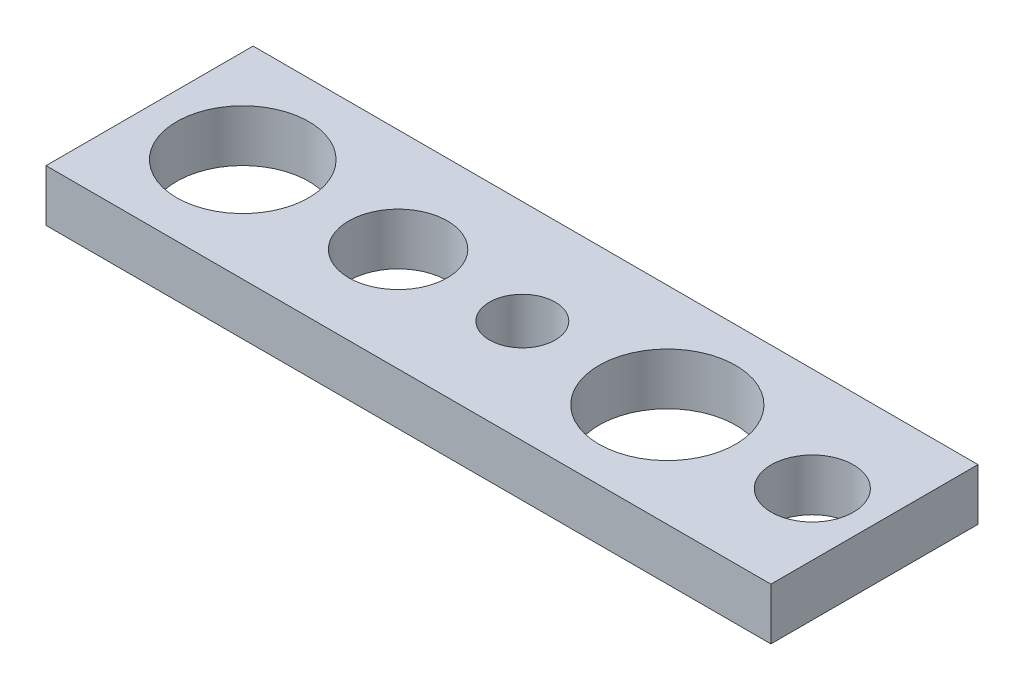
ISO-10303-21;
HEADER;
FILE_DESCRIPTION(('STEP AP214'),'2;1');
FILE_NAME('part.step','',(''),(''),'','','');
FILE_SCHEMA(('AUTOMOTIVE_DESIGN { 1 0 10303 214 1 1 1 1 }'));
ENDSEC;
DATA;
#1=APPLICATION_CONTEXT('core data for automotive mechanical design processes');
#2=APPLICATION_PROTOCOL_DEFINITION('international standard','automotive_design',2000,#1);
#3=PRODUCT_CONTEXT('',#1,'mechanical');
#4=PRODUCT('Part','Part','',(#3));
#5=PRODUCT_RELATED_PRODUCT_CATEGORY('part','',(#4));
#6=PRODUCT_DEFINITION_FORMATION('','',#4);
#7=PRODUCT_DEFINITION_CONTEXT('part definition',#1,'design');
#8=PRODUCT_DEFINITION('design','',#6,#7);
#9=PRODUCT_DEFINITION_SHAPE('','',#8);
#10=(LENGTH_UNIT() NAMED_UNIT(*) SI_UNIT(.MILLI.,.METRE.));
#11=(NAMED_UNIT(*) PLANE_ANGLE_UNIT() SI_UNIT($,.RADIAN.));
#12=(NAMED_UNIT(*) SI_UNIT($,.STERADIAN.) SOLID_ANGLE_UNIT());
#13=UNCERTAINTY_MEASURE_WITH_UNIT(LENGTH_MEASURE(1.E-05),#10,'distance_accuracy_value','');
#14=(GEOMETRIC_REPRESENTATION_CONTEXT(3) GLOBAL_UNCERTAINTY_ASSIGNED_CONTEXT((#13)) GLOBAL_UNIT_ASSIGNED_CONTEXT((#10,
#11,#12)) REPRESENTATION_CONTEXT('',''));
#15=CARTESIAN_POINT('',(0.,0.,0.));
#16=DIRECTION('',(0.,0.,1.));
#17=DIRECTION('',(1.,0.,0.));
#18=AXIS2_PLACEMENT_3D('',#15,#16,#17);
#19=CARTESIAN_POINT('',(-15.5555555555556,5.,-7.72727272727273));
#20=DIRECTION('',(1.,0.,0.));
#21=DIRECTION('',(0.,0.,-1.));
#22=AXIS2_PLACEMENT_3D('',#19,#20,#21);
#23=PLANE('',#22);
#24=DIRECTION('',(0.,0.,1.));
#25=VECTOR('',#24,1.);
#26=CARTESIAN_POINT('',(-15.5555555555556,0.,-7.72727272727273));
#27=LINE('',#26,#25);
#28=CARTESIAN_POINT('',(-15.5555555555556,0.,-7.72727272727273));
#29=VERTEX_POINT('',#28);
#30=CARTESIAN_POINT('',(-15.5555555555556,0.,12.2727272727273));
#31=VERTEX_POINT('',#30);
#32=EDGE_CURVE('E96',#29,#31,#27,.T.);
#33=ORIENTED_EDGE('',*,*,#32,.T.);
#34=DIRECTION('',(0.,-1.,0.));
#35=VECTOR('',#34,1.);
#36=CARTESIAN_POINT('',(-15.5555555555556,5.,12.2727272727273));
#37=LINE('',#36,#35);
#38=CARTESIAN_POINT('',(-15.5555555555556,5.,12.2727272727273));
#39=VERTEX_POINT('',#38);
#40=EDGE_CURVE('E11',#39,#31,#37,.T.);
#41=ORIENTED_EDGE('',*,*,#40,.F.);
#42=DIRECTION('',(0.,0.,1.));
#43=VECTOR('',#42,1.);
#44=CARTESIAN_POINT('',(-15.5555555555556,5.,-7.72727272727273));
#45=LINE('',#44,#43);
#46=CARTESIAN_POINT('',(-15.5555555555556,5.,-7.72727272727273));
#47=VERTEX_POINT('',#46);
#48=EDGE_CURVE('E84',#47,#39,#45,.T.);
#49=ORIENTED_EDGE('',*,*,#48,.F.);
#50=DIRECTION('',(0.,-1.,0.));
#51=VECTOR('',#50,1.);
#52=CARTESIAN_POINT('',(-15.5555555555556,5.,-7.72727272727273));
#53=LINE('',#52,#51);
#54=EDGE_CURVE('E92',#47,#29,#53,.T.);
#55=ORIENTED_EDGE('',*,*,#54,.T.);
#56=EDGE_LOOP('',(#33,#41,#49,#55));
#57=FACE_BOUND('',#56,.T.);
#58=ADVANCED_FACE('F33',(#57),#23,.F.);
#59=CARTESIAN_POINT('',(-15.5555555555556,5.,12.2727272727273));
#60=DIRECTION('',(0.,0.,-1.));
#61=DIRECTION('',(-1.,0.,0.));
#62=AXIS2_PLACEMENT_3D('',#59,#60,#61);
#63=PLANE('',#62);
#64=DIRECTION('',(1.,0.,0.));
#65=VECTOR('',#64,1.);
#66=CARTESIAN_POINT('',(-15.5555555555556,0.,12.2727272727273));
#67=LINE('',#66,#65);
#68=CARTESIAN_POINT('',(54.4444444444444,0.,12.2727272727273));
#69=VERTEX_POINT('',#68);
#70=EDGE_CURVE('E88',#31,#69,#67,.T.);
#71=ORIENTED_EDGE('',*,*,#70,.T.);
#72=DIRECTION('',(0.,-1.,0.));
#73=VECTOR('',#72,1.);
#74=CARTESIAN_POINT('',(54.4444444444444,5.,12.2727272727273));
#75=LINE('',#74,#73);
#76=CARTESIAN_POINT('',(54.4444444444444,5.,12.2727272727273));
#77=VERTEX_POINT('',#76);
#78=EDGE_CURVE('E41',#77,#69,#75,.T.);
#79=ORIENTED_EDGE('',*,*,#78,.F.);
#80=DIRECTION('',(1.,0.,0.));
#81=VECTOR('',#80,1.);
#82=CARTESIAN_POINT('',(-15.5555555555556,5.,12.2727272727273));
#83=LINE('',#82,#81);
#84=EDGE_CURVE('E79',#39,#77,#83,.T.);
#85=ORIENTED_EDGE('',*,*,#84,.F.);
#86=ORIENTED_EDGE('',*,*,#40,.T.);
#87=EDGE_LOOP('',(#71,#79,#85,#86));
#88=FACE_BOUND('',#87,.T.);
#89=ADVANCED_FACE('F87',(#88),#63,.F.);
#90=CARTESIAN_POINT('',(54.4444444444444,5.,-7.72727272727273));
#91=DIRECTION('',(-1.,0.,0.));
#92=DIRECTION('',(0.,0.,1.));
#93=AXIS2_PLACEMENT_3D('',#90,#91,#92);
#94=PLANE('',#93);
#95=DIRECTION('',(0.,0.,-1.));
#96=VECTOR('',#95,1.);
#97=CARTESIAN_POINT('',(54.4444444444444,0.,-7.72727272727273));
#98=LINE('',#97,#96);
#99=CARTESIAN_POINT('',(54.4444444444444,0.,-7.72727272727273));
#100=VERTEX_POINT('',#99);
#101=EDGE_CURVE('E66',#69,#100,#98,.T.);
#102=ORIENTED_EDGE('',*,*,#101,.T.);
#103=DIRECTION('',(0.,-1.,0.));
#104=VECTOR('',#103,1.);
#105=CARTESIAN_POINT('',(54.4444444444444,5.,-7.72727272727273));
#106=LINE('',#105,#104);
#107=CARTESIAN_POINT('',(54.4444444444444,5.,-7.72727272727273));
#108=VERTEX_POINT('',#107);
#109=EDGE_CURVE('E89',#108,#100,#106,.T.);
#110=ORIENTED_EDGE('',*,*,#109,.F.);
#111=DIRECTION('',(0.,0.,-1.));
#112=VECTOR('',#111,1.);
#113=CARTESIAN_POINT('',(54.4444444444444,5.,-7.72727272727273));
#114=LINE('',#113,#112);
#115=EDGE_CURVE('E82',#77,#108,#114,.T.);
#116=ORIENTED_EDGE('',*,*,#115,.F.);
#117=ORIENTED_EDGE('',*,*,#78,.T.);
#118=EDGE_LOOP('',(#102,#110,#116,#117));
#119=FACE_BOUND('',#118,.T.);
#120=ADVANCED_FACE('F90',(#119),#94,.F.);
#121=CARTESIAN_POINT('',(-15.5555555555556,5.,-7.72727272727273));
#122=DIRECTION('',(0.,0.,1.));
#123=DIRECTION('',(1.,0.,0.));
#124=AXIS2_PLACEMENT_3D('',#121,#122,#123);
#125=PLANE('',#124);
#126=DIRECTION('',(-1.,0.,0.));
#127=VECTOR('',#126,1.);
#128=CARTESIAN_POINT('',(-15.5555555555556,0.,-7.72727272727273));
#129=LINE('',#128,#127);
#130=EDGE_CURVE('E72',#100,#29,#129,.T.);
#131=ORIENTED_EDGE('',*,*,#130,.T.);
#132=ORIENTED_EDGE('',*,*,#54,.F.);
#133=DIRECTION('',(-1.,0.,0.));
#134=VECTOR('',#133,1.);
#135=CARTESIAN_POINT('',(-15.5555555555556,5.,-7.72727272727273));
#136=LINE('',#135,#134);
#137=EDGE_CURVE('E49',#108,#47,#136,.T.);
#138=ORIENTED_EDGE('',*,*,#137,.F.);
#139=ORIENTED_EDGE('',*,*,#109,.T.);
#140=EDGE_LOOP('',(#131,#132,#138,#139));
#141=FACE_BOUND('',#140,.T.);
#142=ADVANCED_FACE('F104',(#141),#125,.F.);
#143=CARTESIAN_POINT('',(0.,5.,0.));
#144=DIRECTION('',(0.,1.,0.));
#145=DIRECTION('',(0.,0.,1.));
#146=AXIS2_PLACEMENT_3D('',#143,#144,#145);
#147=PLANE('',#146);
#148=CARTESIAN_POINT('',(-6.55555555555556,5.,2.27272727272727));
#149=DIRECTION('',(0.,1.,0.));
#150=DIRECTION('',(0.,0.,1.));
#151=AXIS2_PLACEMENT_3D('',#148,#149,#150);
#152=CIRCLE('',#151,6.375);
#153=CARTESIAN_POINT('',(-6.55555555555556,5.,8.64772727272727));
#154=VERTEX_POINT('',#153);
#155=EDGE_CURVE('E134',#154,#154,#152,.T.);
#156=ORIENTED_EDGE('',*,*,#155,.F.);
#157=EDGE_LOOP('',(#156));
#158=FACE_BOUND('',#157,.T.);
#159=CARTESIAN_POINT('',(8.44444444444444,5.,2.27272727272727));
#160=DIRECTION('',(0.,1.,0.));
#161=DIRECTION('',(0.,0.,1.));
#162=AXIS2_PLACEMENT_3D('',#159,#160,#161);
#163=CIRCLE('',#162,4.7625);
#164=CARTESIAN_POINT('',(8.44444444444444,5.,7.03522727272727));
#165=VERTEX_POINT('',#164);
#166=EDGE_CURVE('E128',#165,#165,#163,.T.);
#167=ORIENTED_EDGE('',*,*,#166,.F.);
#168=EDGE_LOOP('',(#167));
#169=FACE_BOUND('',#168,.T.);
#170=CARTESIAN_POINT('',(20.4444444444444,5.,2.27272727272727));
#171=DIRECTION('',(0.,1.,0.));
#172=DIRECTION('',(0.,0.,1.));
#173=AXIS2_PLACEMENT_3D('',#170,#171,#172);
#174=CIRCLE('',#173,3.175);
#175=CARTESIAN_POINT('',(20.4444444444444,5.,5.44772727272727));
#176=VERTEX_POINT('',#175);
#177=EDGE_CURVE('E122',#176,#176,#174,.T.);
#178=ORIENTED_EDGE('',*,*,#177,.F.);
#179=EDGE_LOOP('',(#178));
#180=FACE_BOUND('',#179,.T.);
#181=CARTESIAN_POINT('',(34.4444444444444,5.,2.27272727272727));
#182=DIRECTION('',(0.,1.,0.));
#183=DIRECTION('',(0.,0.,1.));
#184=AXIS2_PLACEMENT_3D('',#181,#182,#183);
#185=CIRCLE('',#184,6.6);
#186=CARTESIAN_POINT('',(34.4444444444444,5.,8.87272727272727));
#187=VERTEX_POINT('',#186);
#188=EDGE_CURVE('E116',#187,#187,#185,.T.);
#189=ORIENTED_EDGE('',*,*,#188,.F.);
#190=EDGE_LOOP('',(#189));
#191=FACE_BOUND('',#190,.T.);
#192=CARTESIAN_POINT('',(48.4444444444444,5.,2.27272727272727));
#193=DIRECTION('',(0.,1.,0.));
#194=DIRECTION('',(0.,0.,1.));
#195=AXIS2_PLACEMENT_3D('',#192,#193,#194);
#196=CIRCLE('',#195,3.96875);
#197=CARTESIAN_POINT('',(48.4444444444444,5.,6.24147727272727));
#198=VERTEX_POINT('',#197);
#199=EDGE_CURVE('E110',#198,#198,#196,.T.);
#200=ORIENTED_EDGE('',*,*,#199,.F.);
#201=EDGE_LOOP('',(#200));
#202=FACE_BOUND('',#201,.T.);
#203=ORIENTED_EDGE('',*,*,#48,.T.);
#204=ORIENTED_EDGE('',*,*,#84,.T.);
#205=ORIENTED_EDGE('',*,*,#115,.T.);
#206=ORIENTED_EDGE('',*,*,#137,.T.);
#207=EDGE_LOOP('',(#203,#204,#205,#206));
#208=FACE_BOUND('',#207,.T.);
#209=ADVANCED_FACE('F80',(#158,#169,#180,#191,#202,#208),#147,.T.);
#210=CARTESIAN_POINT('',(0.,0.,0.));
#211=DIRECTION('',(0.,1.,0.));
#212=DIRECTION('',(0.,0.,1.));
#213=AXIS2_PLACEMENT_3D('',#210,#211,#212);
#214=PLANE('',#213);
#215=CARTESIAN_POINT('',(-6.55555555555556,0.,2.27272727272727));
#216=DIRECTION('',(0.,1.,0.));
#217=DIRECTION('',(0.,0.,1.));
#218=AXIS2_PLACEMENT_3D('',#215,#216,#217);
#219=CIRCLE('',#218,6.375);
#220=CARTESIAN_POINT('',(-6.55555555555556,0.,8.64772727272727));
#221=VERTEX_POINT('',#220);
#222=EDGE_CURVE('E99',#221,#221,#219,.T.);
#223=ORIENTED_EDGE('',*,*,#222,.T.);
#224=EDGE_LOOP('',(#223));
#225=FACE_BOUND('',#224,.T.);
#226=CARTESIAN_POINT('',(8.44444444444444,0.,2.27272727272727));
#227=DIRECTION('',(0.,1.,0.));
#228=DIRECTION('',(0.,0.,1.));
#229=AXIS2_PLACEMENT_3D('',#226,#227,#228);
#230=CIRCLE('',#229,4.7625);
#231=CARTESIAN_POINT('',(8.44444444444444,0.,7.03522727272727));
#232=VERTEX_POINT('',#231);
#233=EDGE_CURVE('E131',#232,#232,#230,.T.);
#234=ORIENTED_EDGE('',*,*,#233,.T.);
#235=EDGE_LOOP('',(#234));
#236=FACE_BOUND('',#235,.T.);
#237=CARTESIAN_POINT('',(20.4444444444444,0.,2.27272727272727));
#238=DIRECTION('',(0.,1.,0.));
#239=DIRECTION('',(0.,0.,1.));
#240=AXIS2_PLACEMENT_3D('',#237,#238,#239);
#241=CIRCLE('',#240,3.175);
#242=CARTESIAN_POINT('',(20.4444444444444,0.,5.44772727272727));
#243=VERTEX_POINT('',#242);
#244=EDGE_CURVE('E125',#243,#243,#241,.T.);
#245=ORIENTED_EDGE('',*,*,#244,.T.);
#246=EDGE_LOOP('',(#245));
#247=FACE_BOUND('',#246,.T.);
#248=CARTESIAN_POINT('',(34.4444444444444,0.,2.27272727272727));
#249=DIRECTION('',(0.,1.,0.));
#250=DIRECTION('',(0.,0.,1.));
#251=AXIS2_PLACEMENT_3D('',#248,#249,#250);
#252=CIRCLE('',#251,6.6);
#253=CARTESIAN_POINT('',(34.4444444444444,0.,8.87272727272727));
#254=VERTEX_POINT('',#253);
#255=EDGE_CURVE('E119',#254,#254,#252,.T.);
#256=ORIENTED_EDGE('',*,*,#255,.T.);
#257=EDGE_LOOP('',(#256));
#258=FACE_BOUND('',#257,.T.);
#259=CARTESIAN_POINT('',(48.4444444444444,0.,2.27272727272727));
#260=DIRECTION('',(0.,1.,0.));
#261=DIRECTION('',(0.,0.,1.));
#262=AXIS2_PLACEMENT_3D('',#259,#260,#261);
#263=CIRCLE('',#262,3.96875);
#264=CARTESIAN_POINT('',(48.4444444444444,0.,6.24147727272727));
#265=VERTEX_POINT('',#264);
#266=EDGE_CURVE('E113',#265,#265,#263,.T.);
#267=ORIENTED_EDGE('',*,*,#266,.T.);
#268=EDGE_LOOP('',(#267));
#269=FACE_BOUND('',#268,.T.);
#270=ORIENTED_EDGE('',*,*,#32,.F.);
#271=ORIENTED_EDGE('',*,*,#130,.F.);
#272=ORIENTED_EDGE('',*,*,#101,.F.);
#273=ORIENTED_EDGE('',*,*,#70,.F.);
#274=EDGE_LOOP('',(#270,#271,#272,#273));
#275=FACE_BOUND('',#274,.T.);
#276=ADVANCED_FACE('F107',(#225,#236,#247,#258,#269,#275),#214,.F.);
#277=CARTESIAN_POINT('',(48.4444444444444,0.,2.27272727272727));
#278=DIRECTION('',(0.,1.,0.));
#279=DIRECTION('',(0.,0.,1.));
#280=AXIS2_PLACEMENT_3D('',#277,#278,#279);
#281=CYLINDRICAL_SURFACE('',#280,3.96875);
#282=ORIENTED_EDGE('',*,*,#266,.F.);
#283=EDGE_LOOP('',(#282));
#284=FACE_BOUND('',#283,.T.);
#285=ORIENTED_EDGE('',*,*,#199,.T.);
#286=EDGE_LOOP('',(#285));
#287=FACE_BOUND('',#286,.T.);
#288=ADVANCED_FACE('F160',(#284,#287),#281,.F.);
#289=CARTESIAN_POINT('',(34.4444444444444,0.,2.27272727272727));
#290=DIRECTION('',(0.,1.,0.));
#291=DIRECTION('',(0.,0.,1.));
#292=AXIS2_PLACEMENT_3D('',#289,#290,#291);
#293=CYLINDRICAL_SURFACE('',#292,6.6);
#294=ORIENTED_EDGE('',*,*,#255,.F.);
#295=EDGE_LOOP('',(#294));
#296=FACE_BOUND('',#295,.T.);
#297=ORIENTED_EDGE('',*,*,#188,.T.);
#298=EDGE_LOOP('',(#297));
#299=FACE_BOUND('',#298,.T.);
#300=ADVANCED_FACE('F162',(#296,#299),#293,.F.);
#301=CARTESIAN_POINT('',(20.4444444444444,0.,2.27272727272727));
#302=DIRECTION('',(0.,1.,0.));
#303=DIRECTION('',(0.,0.,1.));
#304=AXIS2_PLACEMENT_3D('',#301,#302,#303);
#305=CYLINDRICAL_SURFACE('',#304,3.175);
#306=ORIENTED_EDGE('',*,*,#244,.F.);
#307=EDGE_LOOP('',(#306));
#308=FACE_BOUND('',#307,.T.);
#309=ORIENTED_EDGE('',*,*,#177,.T.);
#310=EDGE_LOOP('',(#309));
#311=FACE_BOUND('',#310,.T.);
#312=ADVANCED_FACE('F169',(#308,#311),#305,.F.);
#313=CARTESIAN_POINT('',(8.44444444444444,0.,2.27272727272727));
#314=DIRECTION('',(0.,1.,0.));
#315=DIRECTION('',(0.,0.,1.));
#316=AXIS2_PLACEMENT_3D('',#313,#314,#315);
#317=CYLINDRICAL_SURFACE('',#316,4.7625);
#318=ORIENTED_EDGE('',*,*,#233,.F.);
#319=EDGE_LOOP('',(#318));
#320=FACE_BOUND('',#319,.T.);
#321=ORIENTED_EDGE('',*,*,#166,.T.);
#322=EDGE_LOOP('',(#321));
#323=FACE_BOUND('',#322,.T.);
#324=ADVANCED_FACE('F145',(#320,#323),#317,.F.);
#325=CARTESIAN_POINT('',(-6.55555555555556,0.,2.27272727272727));
#326=DIRECTION('',(0.,1.,0.));
#327=DIRECTION('',(0.,0.,1.));
#328=AXIS2_PLACEMENT_3D('',#325,#326,#327);
#329=CYLINDRICAL_SURFACE('',#328,6.375);
#330=ORIENTED_EDGE('',*,*,#222,.F.);
#331=EDGE_LOOP('',(#330));
#332=FACE_BOUND('',#331,.T.);
#333=ORIENTED_EDGE('',*,*,#155,.T.);
#334=EDGE_LOOP('',(#333));
#335=FACE_BOUND('',#334,.T.);
#336=ADVANCED_FACE('F142',(#332,#335),#329,.F.);
#337=CLOSED_SHELL('',(#58,#89,#120,#142,#209,#276,#288,#300,#312,#324,#336));
#338=MANIFOLD_SOLID_BREP('B2',#337);
#339=ADVANCED_BREP_SHAPE_REPRESENTATION('',(#18,#338),#14);
#340=SHAPE_DEFINITION_REPRESENTATION(#9,#339);
ENDSEC;
END-ISO-10303-21;
